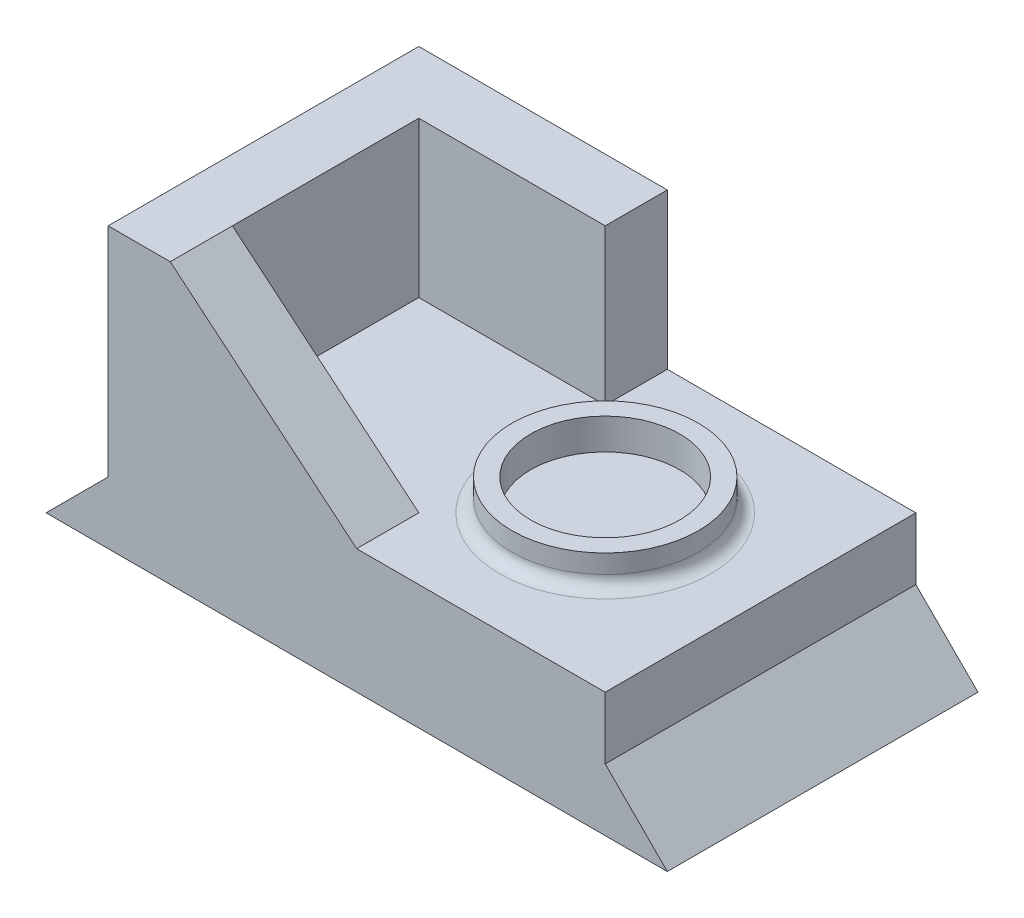
ISO-10303-21;
HEADER;
FILE_DESCRIPTION(('STEP AP214'),'2;1');
FILE_NAME('part.step','',(''),(''),'','','');
FILE_SCHEMA(('AUTOMOTIVE_DESIGN { 1 0 10303 214 1 1 1 1 }'));
ENDSEC;
DATA;
#1=APPLICATION_CONTEXT('core data for automotive mechanical design processes');
#2=APPLICATION_PROTOCOL_DEFINITION('international standard','automotive_design',2000,#1);
#3=PRODUCT_CONTEXT('',#1,'mechanical');
#4=PRODUCT('Part','Part','',(#3));
#5=PRODUCT_RELATED_PRODUCT_CATEGORY('part','',(#4));
#6=PRODUCT_DEFINITION_FORMATION('','',#4);
#7=PRODUCT_DEFINITION_CONTEXT('part definition',#1,'design');
#8=PRODUCT_DEFINITION('design','',#6,#7);
#9=PRODUCT_DEFINITION_SHAPE('','',#8);
#10=(LENGTH_UNIT() NAMED_UNIT(*) SI_UNIT(.MILLI.,.METRE.));
#11=(NAMED_UNIT(*) PLANE_ANGLE_UNIT() SI_UNIT($,.RADIAN.));
#12=(NAMED_UNIT(*) SI_UNIT($,.STERADIAN.) SOLID_ANGLE_UNIT());
#13=UNCERTAINTY_MEASURE_WITH_UNIT(LENGTH_MEASURE(1.E-05),#10,'distance_accuracy_value','');
#14=(GEOMETRIC_REPRESENTATION_CONTEXT(3) GLOBAL_UNCERTAINTY_ASSIGNED_CONTEXT((#13)) GLOBAL_UNIT_ASSIGNED_CONTEXT((#10,
#11,#12)) REPRESENTATION_CONTEXT('',''));
#15=CARTESIAN_POINT('',(0.,0.,0.));
#16=DIRECTION('',(0.,0.,1.));
#17=DIRECTION('',(1.,0.,0.));
#18=AXIS2_PLACEMENT_3D('',#15,#16,#17);
#19=CARTESIAN_POINT('',(100.,0.,-50.));
#20=DIRECTION('',(0.,-1.,0.));
#21=DIRECTION('',(1.,0.,0.));
#22=AXIS2_PLACEMENT_3D('',#19,#20,#21);
#23=PLANE('',#22);
#24=DIRECTION('',(1.,0.,0.));
#25=VECTOR('',#24,1.);
#26=CARTESIAN_POINT('',(100.,0.,0.));
#27=LINE('',#26,#25);
#28=CARTESIAN_POINT('',(0.,0.,0.));
#29=VERTEX_POINT('',#28);
#30=CARTESIAN_POINT('',(100.,0.,0.));
#31=VERTEX_POINT('',#30);
#32=EDGE_CURVE('E188',#29,#31,#27,.T.);
#33=ORIENTED_EDGE('',*,*,#32,.F.);
#34=DIRECTION('',(0.,0.,1.));
#35=VECTOR('',#34,1.);
#36=CARTESIAN_POINT('',(0.,0.,-50.));
#37=LINE('',#36,#35);
#38=CARTESIAN_POINT('',(0.,0.,-50.));
#39=VERTEX_POINT('',#38);
#40=EDGE_CURVE('E246',#39,#29,#37,.T.);
#41=ORIENTED_EDGE('',*,*,#40,.F.);
#42=DIRECTION('',(1.,0.,0.));
#43=VECTOR('',#42,1.);
#44=CARTESIAN_POINT('',(100.,0.,-50.));
#45=LINE('',#44,#43);
#46=CARTESIAN_POINT('',(100.,0.,-50.));
#47=VERTEX_POINT('',#46);
#48=EDGE_CURVE('E189',#39,#47,#45,.T.);
#49=ORIENTED_EDGE('',*,*,#48,.T.);
#50=DIRECTION('',(0.,0.,1.));
#51=VECTOR('',#50,1.);
#52=CARTESIAN_POINT('',(100.,0.,-50.));
#53=LINE('',#52,#51);
#54=EDGE_CURVE('E215',#47,#31,#53,.T.);
#55=ORIENTED_EDGE('',*,*,#54,.T.);
#56=EDGE_LOOP('',(#33,#41,#49,#55));
#57=FACE_BOUND('',#56,.T.);
#58=ADVANCED_FACE('F49',(#57),#23,.T.);
#59=CARTESIAN_POINT('',(0.,0.,-50.));
#60=DIRECTION('',(-0.707106781186547,0.707106781186548,0.));
#61=DIRECTION('',(-0.707106781186548,-0.707106781186547,0.));
#62=AXIS2_PLACEMENT_3D('',#59,#60,#61);
#63=PLANE('',#62);
#64=DIRECTION('',(-0.707106781186548,-0.707106781186547,0.));
#65=VECTOR('',#64,1.);
#66=CARTESIAN_POINT('',(0.,0.,0.));
#67=LINE('',#66,#65);
#68=CARTESIAN_POINT('',(10.,10.,0.));
#69=VERTEX_POINT('',#68);
#70=EDGE_CURVE('E194',#69,#29,#67,.T.);
#71=ORIENTED_EDGE('',*,*,#70,.F.);
#72=DIRECTION('',(0.,0.,1.));
#73=VECTOR('',#72,1.);
#74=CARTESIAN_POINT('',(10.,10.,-50.));
#75=LINE('',#74,#73);
#76=CARTESIAN_POINT('',(10.,10.,-50.));
#77=VERTEX_POINT('',#76);
#78=EDGE_CURVE('E250',#77,#69,#75,.T.);
#79=ORIENTED_EDGE('',*,*,#78,.F.);
#80=DIRECTION('',(-0.707106781186548,-0.707106781186547,0.));
#81=VECTOR('',#80,1.);
#82=CARTESIAN_POINT('',(0.,0.,-50.));
#83=LINE('',#82,#81);
#84=EDGE_CURVE('E211',#77,#39,#83,.T.);
#85=ORIENTED_EDGE('',*,*,#84,.T.);
#86=ORIENTED_EDGE('',*,*,#40,.T.);
#87=EDGE_LOOP('',(#71,#79,#85,#86));
#88=FACE_BOUND('',#87,.T.);
#89=ADVANCED_FACE('F292',(#88),#63,.T.);
#90=CARTESIAN_POINT('',(10.,10.,-50.));
#91=DIRECTION('',(-1.,0.,0.));
#92=DIRECTION('',(0.,0.,1.));
#93=AXIS2_PLACEMENT_3D('',#90,#91,#92);
#94=PLANE('',#93);
#95=DIRECTION('',(0.,-1.,0.));
#96=VECTOR('',#95,1.);
#97=CARTESIAN_POINT('',(10.,10.,0.));
#98=LINE('',#97,#96);
#99=CARTESIAN_POINT('',(10.,45.,0.));
#100=VERTEX_POINT('',#99);
#101=EDGE_CURVE('E239',#100,#69,#98,.T.);
#102=ORIENTED_EDGE('',*,*,#101,.F.);
#103=DIRECTION('',(0.,0.,1.));
#104=VECTOR('',#103,1.);
#105=CARTESIAN_POINT('',(10.,45.,-50.));
#106=LINE('',#105,#104);
#107=CARTESIAN_POINT('',(10.,45.,-50.));
#108=VERTEX_POINT('',#107);
#109=EDGE_CURVE('E253',#108,#100,#106,.T.);
#110=ORIENTED_EDGE('',*,*,#109,.F.);
#111=DIRECTION('',(0.,-1.,0.));
#112=VECTOR('',#111,1.);
#113=CARTESIAN_POINT('',(10.,10.,-50.));
#114=LINE('',#113,#112);
#115=EDGE_CURVE('E207',#108,#77,#114,.T.);
#116=ORIENTED_EDGE('',*,*,#115,.T.);
#117=ORIENTED_EDGE('',*,*,#78,.T.);
#118=EDGE_LOOP('',(#102,#110,#116,#117));
#119=FACE_BOUND('',#118,.T.);
#120=ADVANCED_FACE('F298',(#119),#94,.T.);
#121=CARTESIAN_POINT('',(10.,45.,-50.));
#122=DIRECTION('',(0.,1.,0.));
#123=DIRECTION('',(0.,0.,1.));
#124=AXIS2_PLACEMENT_3D('',#121,#122,#123);
#125=PLANE('',#124);
#126=DIRECTION('',(-1.,0.,0.));
#127=VECTOR('',#126,1.);
#128=CARTESIAN_POINT('',(10.,45.,0.));
#129=LINE('',#128,#127);
#130=CARTESIAN_POINT('',(20.,45.,0.));
#131=VERTEX_POINT('',#130);
#132=EDGE_CURVE('E235',#131,#100,#129,.T.);
#133=ORIENTED_EDGE('',*,*,#132,.F.);
#134=DIRECTION('',(0.,0.,1.));
#135=VECTOR('',#134,1.);
#136=CARTESIAN_POINT('',(20.,45.,-50.));
#137=LINE('',#136,#135);
#138=CARTESIAN_POINT('',(20.,45.,-10.));
#139=VERTEX_POINT('',#138);
#140=EDGE_CURVE('E258',#139,#131,#137,.T.);
#141=ORIENTED_EDGE('',*,*,#140,.F.);
#142=CARTESIAN_POINT('',(20.,45.,-40.));
#143=VERTEX_POINT('',#142);
#144=EDGE_CURVE('E159',#143,#139,#137,.T.);
#145=ORIENTED_EDGE('',*,*,#144,.F.);
#146=DIRECTION('',(1.,0.,0.));
#147=VECTOR('',#146,1.);
#148=CARTESIAN_POINT('',(50.,45.,-40.));
#149=LINE('',#148,#147);
#150=CARTESIAN_POINT('',(50.,45.,-40.));
#151=VERTEX_POINT('',#150);
#152=EDGE_CURVE('E151',#143,#151,#149,.T.);
#153=ORIENTED_EDGE('',*,*,#152,.T.);
#154=DIRECTION('',(0.,0.,-1.));
#155=VECTOR('',#154,1.);
#156=CARTESIAN_POINT('',(50.,45.,-40.));
#157=LINE('',#156,#155);
#158=CARTESIAN_POINT('',(50.,45.,-50.));
#159=VERTEX_POINT('',#158);
#160=EDGE_CURVE('E135',#151,#159,#157,.T.);
#161=ORIENTED_EDGE('',*,*,#160,.T.);
#162=DIRECTION('',(-1.,0.,0.));
#163=VECTOR('',#162,1.);
#164=CARTESIAN_POINT('',(10.,45.,-50.));
#165=LINE('',#164,#163);
#166=EDGE_CURVE('E204',#159,#108,#165,.T.);
#167=ORIENTED_EDGE('',*,*,#166,.T.);
#168=ORIENTED_EDGE('',*,*,#109,.T.);
#169=EDGE_LOOP('',(#133,#141,#145,#153,#161,#167,#168));
#170=FACE_BOUND('',#169,.T.);
#171=ADVANCED_FACE('F157',(#170),#125,.T.);
#172=CARTESIAN_POINT('',(20.,45.,-50.));
#173=DIRECTION('',(0.64018439966448,0.768221279597376,0.));
#174=DIRECTION('',(-0.768221279597376,0.64018439966448,0.));
#175=AXIS2_PLACEMENT_3D('',#172,#173,#174);
#176=PLANE('',#175);
#177=DIRECTION('',(0.768221279597376,-0.64018439966448,0.));
#178=VECTOR('',#177,1.);
#179=CARTESIAN_POINT('',(50.,20.,-10.));
#180=LINE('',#179,#178);
#181=CARTESIAN_POINT('',(50.,20.,-10.));
#182=VERTEX_POINT('',#181);
#183=EDGE_CURVE('E145',#139,#182,#180,.T.);
#184=ORIENTED_EDGE('',*,*,#183,.F.);
#185=ORIENTED_EDGE('',*,*,#140,.T.);
#186=DIRECTION('',(-0.768221279597376,0.64018439966448,0.));
#187=VECTOR('',#186,1.);
#188=CARTESIAN_POINT('',(20.,45.,0.));
#189=LINE('',#188,#187);
#190=CARTESIAN_POINT('',(50.,20.,0.));
#191=VERTEX_POINT('',#190);
#192=EDGE_CURVE('E231',#191,#131,#189,.T.);
#193=ORIENTED_EDGE('',*,*,#192,.F.);
#194=DIRECTION('',(0.,0.,1.));
#195=VECTOR('',#194,1.);
#196=CARTESIAN_POINT('',(50.,20.,-50.));
#197=LINE('',#196,#195);
#198=EDGE_CURVE('E259',#182,#191,#197,.T.);
#199=ORIENTED_EDGE('',*,*,#198,.F.);
#200=EDGE_LOOP('',(#184,#185,#193,#199));
#201=FACE_BOUND('',#200,.T.);
#202=ADVANCED_FACE('F313',(#201),#176,.T.);
#203=CARTESIAN_POINT('',(50.,20.,-50.));
#204=DIRECTION('',(0.,1.,0.));
#205=DIRECTION('',(0.,0.,1.));
#206=AXIS2_PLACEMENT_3D('',#203,#204,#205);
#207=PLANE('',#206);
#208=CARTESIAN_POINT('',(65.,20.,-25.));
#209=DIRECTION('',(0.,1.,0.));
#210=DIRECTION('',(0.,0.,1.));
#211=AXIS2_PLACEMENT_3D('',#208,#209,#210);
#212=CIRCLE('',#211,17.);
#213=CARTESIAN_POINT('',(65.,20.,-8.00000000000001));
#214=VERTEX_POINT('',#213);
#215=EDGE_CURVE('E11',#214,#214,#212,.F.);
#216=ORIENTED_EDGE('',*,*,#215,.T.);
#217=EDGE_LOOP('',(#216));
#218=FACE_BOUND('',#217,.T.);
#219=DIRECTION('',(0.,0.,-1.));
#220=VECTOR('',#219,1.);
#221=CARTESIAN_POINT('',(50.,20.,-40.));
#222=LINE('',#221,#220);
#223=CARTESIAN_POINT('',(50.,20.,-40.));
#224=VERTEX_POINT('',#223);
#225=CARTESIAN_POINT('',(50.,20.,-50.));
#226=VERTEX_POINT('',#225);
#227=EDGE_CURVE('E65',#224,#226,#222,.T.);
#228=ORIENTED_EDGE('',*,*,#227,.F.);
#229=DIRECTION('',(-1.,0.,0.));
#230=VECTOR('',#229,1.);
#231=CARTESIAN_POINT('',(50.,20.,-40.));
#232=LINE('',#231,#230);
#233=CARTESIAN_POINT('',(20.,20.,-40.));
#234=VERTEX_POINT('',#233);
#235=EDGE_CURVE('E152',#224,#234,#232,.T.);
#236=ORIENTED_EDGE('',*,*,#235,.T.);
#237=DIRECTION('',(0.,0.,-1.));
#238=VECTOR('',#237,1.);
#239=CARTESIAN_POINT('',(20.,20.,-10.));
#240=LINE('',#239,#238);
#241=CARTESIAN_POINT('',(20.,20.,-10.));
#242=VERTEX_POINT('',#241);
#243=EDGE_CURVE('E184',#242,#234,#240,.T.);
#244=ORIENTED_EDGE('',*,*,#243,.F.);
#245=DIRECTION('',(-1.,0.,0.));
#246=VECTOR('',#245,1.);
#247=CARTESIAN_POINT('',(20.,20.,-10.));
#248=LINE('',#247,#246);
#249=EDGE_CURVE('E176',#182,#242,#248,.T.);
#250=ORIENTED_EDGE('',*,*,#249,.F.);
#251=ORIENTED_EDGE('',*,*,#198,.T.);
#252=DIRECTION('',(-1.,0.,0.));
#253=VECTOR('',#252,1.);
#254=CARTESIAN_POINT('',(50.,20.,0.));
#255=LINE('',#254,#253);
#256=CARTESIAN_POINT('',(90.,20.,0.));
#257=VERTEX_POINT('',#256);
#258=EDGE_CURVE('E227',#257,#191,#255,.T.);
#259=ORIENTED_EDGE('',*,*,#258,.F.);
#260=DIRECTION('',(0.,0.,1.));
#261=VECTOR('',#260,1.);
#262=CARTESIAN_POINT('',(90.,20.,-50.));
#263=LINE('',#262,#261);
#264=CARTESIAN_POINT('',(90.,20.,-50.));
#265=VERTEX_POINT('',#264);
#266=EDGE_CURVE('E262',#265,#257,#263,.T.);
#267=ORIENTED_EDGE('',*,*,#266,.F.);
#268=DIRECTION('',(-1.,0.,0.));
#269=VECTOR('',#268,1.);
#270=CARTESIAN_POINT('',(50.,20.,-50.));
#271=LINE('',#270,#269);
#272=EDGE_CURVE('E70',#265,#226,#271,.T.);
#273=ORIENTED_EDGE('',*,*,#272,.T.);
#274=EDGE_LOOP('',(#228,#236,#244,#250,#251,#259,#267,#273));
#275=FACE_BOUND('',#274,.T.);
#276=ADVANCED_FACE('F289',(#218,#275),#207,.T.);
#277=CARTESIAN_POINT('',(90.,20.,-50.));
#278=DIRECTION('',(1.,0.,0.));
#279=DIRECTION('',(0.,0.,-1.));
#280=AXIS2_PLACEMENT_3D('',#277,#278,#279);
#281=PLANE('',#280);
#282=DIRECTION('',(0.,1.,0.));
#283=VECTOR('',#282,1.);
#284=CARTESIAN_POINT('',(90.,20.,0.));
#285=LINE('',#284,#283);
#286=CARTESIAN_POINT('',(90.,10.,0.));
#287=VERTEX_POINT('',#286);
#288=EDGE_CURVE('E223',#287,#257,#285,.T.);
#289=ORIENTED_EDGE('',*,*,#288,.F.);
#290=DIRECTION('',(0.,0.,1.));
#291=VECTOR('',#290,1.);
#292=CARTESIAN_POINT('',(90.,10.,-50.));
#293=LINE('',#292,#291);
#294=CARTESIAN_POINT('',(90.,10.,-50.));
#295=VERTEX_POINT('',#294);
#296=EDGE_CURVE('E265',#295,#287,#293,.T.);
#297=ORIENTED_EDGE('',*,*,#296,.F.);
#298=DIRECTION('',(0.,1.,0.));
#299=VECTOR('',#298,1.);
#300=CARTESIAN_POINT('',(90.,20.,-50.));
#301=LINE('',#300,#299);
#302=EDGE_CURVE('E198',#295,#265,#301,.T.);
#303=ORIENTED_EDGE('',*,*,#302,.T.);
#304=ORIENTED_EDGE('',*,*,#266,.T.);
#305=EDGE_LOOP('',(#289,#297,#303,#304));
#306=FACE_BOUND('',#305,.T.);
#307=ADVANCED_FACE('F307',(#306),#281,.T.);
#308=CARTESIAN_POINT('',(90.,10.,-50.));
#309=DIRECTION('',(0.707106781186548,0.707106781186547,0.));
#310=DIRECTION('',(-0.707106781186547,0.707106781186548,0.));
#311=AXIS2_PLACEMENT_3D('',#308,#309,#310);
#312=PLANE('',#311);
#313=DIRECTION('',(-0.707106781186547,0.707106781186548,0.));
#314=VECTOR('',#313,1.);
#315=CARTESIAN_POINT('',(90.,10.,0.));
#316=LINE('',#315,#314);
#317=EDGE_CURVE('E219',#31,#287,#316,.T.);
#318=ORIENTED_EDGE('',*,*,#317,.F.);
#319=ORIENTED_EDGE('',*,*,#54,.F.);
#320=DIRECTION('',(-0.707106781186547,0.707106781186548,0.));
#321=VECTOR('',#320,1.);
#322=CARTESIAN_POINT('',(90.,10.,-50.));
#323=LINE('',#322,#321);
#324=EDGE_CURVE('E193',#47,#295,#323,.T.);
#325=ORIENTED_EDGE('',*,*,#324,.T.);
#326=ORIENTED_EDGE('',*,*,#296,.T.);
#327=EDGE_LOOP('',(#318,#319,#325,#326));
#328=FACE_BOUND('',#327,.T.);
#329=ADVANCED_FACE('F303',(#328),#312,.T.);
#330=CARTESIAN_POINT('',(0.,0.,-50.));
#331=DIRECTION('',(0.,0.,-1.));
#332=DIRECTION('',(-1.,0.,0.));
#333=AXIS2_PLACEMENT_3D('',#330,#331,#332);
#334=PLANE('',#333);
#335=ORIENTED_EDGE('',*,*,#166,.F.);
#336=DIRECTION('',(0.,-1.,0.));
#337=VECTOR('',#336,1.);
#338=CARTESIAN_POINT('',(50.,20.,-50.));
#339=LINE('',#338,#337);
#340=EDGE_CURVE('E140',#159,#226,#339,.T.);
#341=ORIENTED_EDGE('',*,*,#340,.T.);
#342=ORIENTED_EDGE('',*,*,#272,.F.);
#343=ORIENTED_EDGE('',*,*,#302,.F.);
#344=ORIENTED_EDGE('',*,*,#324,.F.);
#345=ORIENTED_EDGE('',*,*,#48,.F.);
#346=ORIENTED_EDGE('',*,*,#84,.F.);
#347=ORIENTED_EDGE('',*,*,#115,.F.);
#348=EDGE_LOOP('',(#335,#341,#342,#343,#344,#345,#346,#347));
#349=FACE_BOUND('',#348,.T.);
#350=ADVANCED_FACE('F306',(#349),#334,.T.);
#351=CARTESIAN_POINT('',(0.,0.,0.));
#352=DIRECTION('',(0.,0.,-1.));
#353=DIRECTION('',(-1.,0.,0.));
#354=AXIS2_PLACEMENT_3D('',#351,#352,#353);
#355=PLANE('',#354);
#356=ORIENTED_EDGE('',*,*,#32,.T.);
#357=ORIENTED_EDGE('',*,*,#317,.T.);
#358=ORIENTED_EDGE('',*,*,#288,.T.);
#359=ORIENTED_EDGE('',*,*,#258,.T.);
#360=ORIENTED_EDGE('',*,*,#192,.T.);
#361=ORIENTED_EDGE('',*,*,#132,.T.);
#362=ORIENTED_EDGE('',*,*,#101,.T.);
#363=ORIENTED_EDGE('',*,*,#70,.T.);
#364=EDGE_LOOP('',(#356,#357,#358,#359,#360,#361,#362,#363));
#365=FACE_BOUND('',#364,.T.);
#366=ADVANCED_FACE('F323',(#365),#355,.F.);
#367=CARTESIAN_POINT('',(20.,45.,-10.));
#368=DIRECTION('',(-1.,0.,0.));
#369=DIRECTION('',(0.,-1.,0.));
#370=AXIS2_PLACEMENT_3D('',#367,#368,#369);
#371=PLANE('',#370);
#372=ORIENTED_EDGE('',*,*,#243,.T.);
#373=DIRECTION('',(0.,1.,0.));
#374=VECTOR('',#373,1.);
#375=CARTESIAN_POINT('',(20.,20.,-40.));
#376=LINE('',#375,#374);
#377=EDGE_CURVE('E161',#234,#143,#376,.T.);
#378=ORIENTED_EDGE('',*,*,#377,.T.);
#379=ORIENTED_EDGE('',*,*,#144,.T.);
#380=DIRECTION('',(0.,1.,0.));
#381=VECTOR('',#380,1.);
#382=CARTESIAN_POINT('',(20.,45.,-10.));
#383=LINE('',#382,#381);
#384=EDGE_CURVE('E180',#242,#139,#383,.T.);
#385=ORIENTED_EDGE('',*,*,#384,.F.);
#386=EDGE_LOOP('',(#372,#378,#379,#385));
#387=FACE_BOUND('',#386,.T.);
#388=ADVANCED_FACE('F326',(#387),#371,.F.);
#389=CARTESIAN_POINT('',(0.,0.,-9.99999999999999));
#390=DIRECTION('',(0.,0.,1.));
#391=DIRECTION('',(1.,0.,0.));
#392=AXIS2_PLACEMENT_3D('',#389,#390,#391);
#393=PLANE('',#392);
#394=ORIENTED_EDGE('',*,*,#183,.T.);
#395=ORIENTED_EDGE('',*,*,#249,.T.);
#396=ORIENTED_EDGE('',*,*,#384,.T.);
#397=EDGE_LOOP('',(#394,#395,#396));
#398=FACE_BOUND('',#397,.T.);
#399=ADVANCED_FACE('F333',(#398),#393,.F.);
#400=CARTESIAN_POINT('',(50.,20.,-40.));
#401=DIRECTION('',(1.,0.,0.));
#402=DIRECTION('',(0.,0.,-1.));
#403=AXIS2_PLACEMENT_3D('',#400,#401,#402);
#404=PLANE('',#403);
#405=ORIENTED_EDGE('',*,*,#340,.F.);
#406=ORIENTED_EDGE('',*,*,#160,.F.);
#407=DIRECTION('',(0.,-1.,0.));
#408=VECTOR('',#407,1.);
#409=CARTESIAN_POINT('',(50.,20.,-40.));
#410=LINE('',#409,#408);
#411=EDGE_CURVE('E138',#151,#224,#410,.T.);
#412=ORIENTED_EDGE('',*,*,#411,.T.);
#413=ORIENTED_EDGE('',*,*,#227,.T.);
#414=EDGE_LOOP('',(#405,#406,#412,#413));
#415=FACE_BOUND('',#414,.T.);
#416=ADVANCED_FACE('F137',(#415),#404,.T.);
#417=CARTESIAN_POINT('',(0.,0.,-40.));
#418=DIRECTION('',(0.,0.,1.));
#419=DIRECTION('',(1.,0.,0.));
#420=AXIS2_PLACEMENT_3D('',#417,#418,#419);
#421=PLANE('',#420);
#422=ORIENTED_EDGE('',*,*,#411,.F.);
#423=ORIENTED_EDGE('',*,*,#152,.F.);
#424=ORIENTED_EDGE('',*,*,#377,.F.);
#425=ORIENTED_EDGE('',*,*,#235,.F.);
#426=EDGE_LOOP('',(#422,#423,#424,#425));
#427=FACE_BOUND('',#426,.T.);
#428=ADVANCED_FACE('F149',(#427),#421,.T.);
#429=CARTESIAN_POINT('',(65.,25.,-25.));
#430=DIRECTION('',(0.,1.,0.));
#431=DIRECTION('',(0.,0.,1.));
#432=AXIS2_PLACEMENT_3D('',#429,#430,#431);
#433=PLANE('',#432);
#434=CARTESIAN_POINT('',(65.,25.,-25.));
#435=DIRECTION('',(0.,1.,0.));
#436=DIRECTION('',(0.,0.,1.));
#437=AXIS2_PLACEMENT_3D('',#434,#435,#436);
#438=CIRCLE('',#437,15.);
#439=CARTESIAN_POINT('',(65.,25.,-10.));
#440=VERTEX_POINT('',#439);
#441=EDGE_CURVE('E171',#440,#440,#438,.T.);
#442=ORIENTED_EDGE('',*,*,#441,.T.);
#443=EDGE_LOOP('',(#442));
#444=FACE_BOUND('',#443,.T.);
#445=CARTESIAN_POINT('',(65.,25.,-25.));
#446=DIRECTION('',(0.,1.,0.));
#447=DIRECTION('',(0.,0.,1.));
#448=AXIS2_PLACEMENT_3D('',#445,#446,#447);
#449=CIRCLE('',#448,12.);
#450=CARTESIAN_POINT('',(65.,25.,-13.));
#451=VERTEX_POINT('',#450);
#452=EDGE_CURVE('E357',#451,#451,#449,.T.);
#453=ORIENTED_EDGE('',*,*,#452,.F.);
#454=EDGE_LOOP('',(#453));
#455=FACE_BOUND('',#454,.T.);
#456=ADVANCED_FACE('F342',(#444,#455),#433,.T.);
#457=CARTESIAN_POINT('',(65.,25.,-25.));
#458=DIRECTION('',(0.,-1.,0.));
#459=DIRECTION('',(0.,0.,-1.));
#460=AXIS2_PLACEMENT_3D('',#457,#458,#459);
#461=CYLINDRICAL_SURFACE('',#460,15.);
#462=CARTESIAN_POINT('',(65.,22.,-25.));
#463=DIRECTION('',(0.,1.,0.));
#464=DIRECTION('',(0.,0.,1.));
#465=AXIS2_PLACEMENT_3D('',#462,#463,#464);
#466=CIRCLE('',#465,15.);
#467=CARTESIAN_POINT('',(65.,22.,-10.));
#468=VERTEX_POINT('',#467);
#469=EDGE_CURVE('E58',#468,#468,#466,.T.);
#470=ORIENTED_EDGE('',*,*,#469,.T.);
#471=EDGE_LOOP('',(#470));
#472=FACE_BOUND('',#471,.T.);
#473=ORIENTED_EDGE('',*,*,#441,.F.);
#474=EDGE_LOOP('',(#473));
#475=FACE_BOUND('',#474,.T.);
#476=ADVANCED_FACE('F277',(#472,#475),#461,.T.);
#477=CARTESIAN_POINT('',(65.,25.,-25.));
#478=DIRECTION('',(0.,-1.,0.));
#479=DIRECTION('',(0.,0.,-1.));
#480=AXIS2_PLACEMENT_3D('',#477,#478,#479);
#481=CYLINDRICAL_SURFACE('',#480,12.);
#482=ORIENTED_EDGE('',*,*,#452,.T.);
#483=EDGE_LOOP('',(#482));
#484=FACE_BOUND('',#483,.T.);
#485=CARTESIAN_POINT('',(65.,20.,-25.));
#486=DIRECTION('',(0.,1.,0.));
#487=DIRECTION('',(0.,0.,1.));
#488=AXIS2_PLACEMENT_3D('',#485,#486,#487);
#489=CIRCLE('',#488,12.);
#490=CARTESIAN_POINT('',(65.,20.,-13.));
#491=VERTEX_POINT('',#490);
#492=EDGE_CURVE('E249',#491,#491,#489,.F.);
#493=ORIENTED_EDGE('',*,*,#492,.T.);
#494=EDGE_LOOP('',(#493));
#495=FACE_BOUND('',#494,.T.);
#496=ADVANCED_FACE('F286',(#484,#495),#481,.F.);
#497=ORIENTED_EDGE('',*,*,#492,.F.);
#498=EDGE_LOOP('',(#497));
#499=FACE_BOUND('',#498,.T.);
#500=ADVANCED_FACE('F281',(#499),#207,.T.);
#501=CARTESIAN_POINT('',(65.,22.,-25.));
#502=DIRECTION('',(0.,1.,0.));
#503=DIRECTION('',(0.,0.,1.));
#504=AXIS2_PLACEMENT_3D('',#501,#502,#503);
#505=TOROIDAL_SURFACE('',#504,17.,2.);
#506=ORIENTED_EDGE('',*,*,#215,.F.);
#507=EDGE_LOOP('',(#506));
#508=FACE_BOUND('',#507,.T.);
#509=ORIENTED_EDGE('',*,*,#469,.F.);
#510=EDGE_LOOP('',(#509));
#511=FACE_BOUND('',#510,.T.);
#512=ADVANCED_FACE('F51',(#508,#511),#505,.F.);
#513=CLOSED_SHELL('',(#58,#89,#120,#171,#202,#276,#307,#329,#350,#366,#388,#399,#416,#428,#456,
#476,#496,#500,#512));
#514=MANIFOLD_SOLID_BREP('B2',#513);
#515=ADVANCED_BREP_SHAPE_REPRESENTATION('',(#18,#514),#14);
#516=SHAPE_DEFINITION_REPRESENTATION(#9,#515);
ENDSEC;
END-ISO-10303-21;
